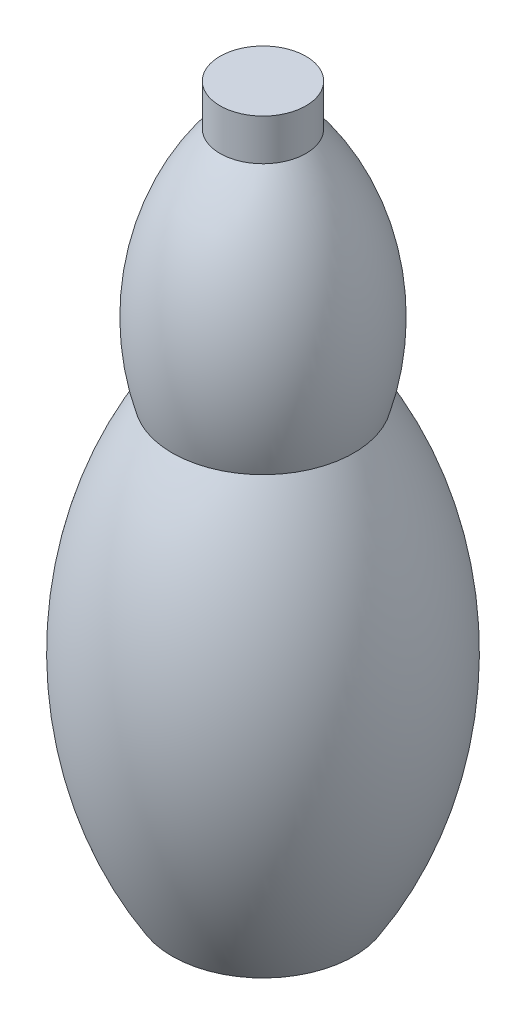
ISO-10303-21;
HEADER;
FILE_DESCRIPTION(('STEP AP214'),'2;1');
FILE_NAME('part.step','',(''),(''),'','','');
FILE_SCHEMA(('AUTOMOTIVE_DESIGN { 1 0 10303 214 1 1 1 1 }'));
ENDSEC;
DATA;
#1=APPLICATION_CONTEXT('core data for automotive mechanical design processes');
#2=APPLICATION_PROTOCOL_DEFINITION('international standard','automotive_design',2000,#1);
#3=PRODUCT_CONTEXT('',#1,'mechanical');
#4=PRODUCT('Part','Part','',(#3));
#5=PRODUCT_RELATED_PRODUCT_CATEGORY('part','',(#4));
#6=PRODUCT_DEFINITION_FORMATION('','',#4);
#7=PRODUCT_DEFINITION_CONTEXT('part definition',#1,'design');
#8=PRODUCT_DEFINITION('design','',#6,#7);
#9=PRODUCT_DEFINITION_SHAPE('','',#8);
#10=(LENGTH_UNIT() NAMED_UNIT(*) SI_UNIT(.MILLI.,.METRE.));
#11=(NAMED_UNIT(*) PLANE_ANGLE_UNIT() SI_UNIT($,.RADIAN.));
#12=(NAMED_UNIT(*) SI_UNIT($,.STERADIAN.) SOLID_ANGLE_UNIT());
#13=UNCERTAINTY_MEASURE_WITH_UNIT(LENGTH_MEASURE(1.E-05),#10,'distance_accuracy_value','');
#14=(GEOMETRIC_REPRESENTATION_CONTEXT(3) GLOBAL_UNCERTAINTY_ASSIGNED_CONTEXT((#13)) GLOBAL_UNIT_ASSIGNED_CONTEXT((#10,
#11,#12)) REPRESENTATION_CONTEXT('',''));
#15=CARTESIAN_POINT('',(0.,0.,0.));
#16=DIRECTION('',(0.,0.,1.));
#17=DIRECTION('',(1.,0.,0.));
#18=AXIS2_PLACEMENT_3D('',#15,#16,#17);
#19=CARTESIAN_POINT('',(19.1239630264316,0.,0.));
#20=DIRECTION('',(0.,-1.,0.));
#21=DIRECTION('',(0.,0.,-1.));
#22=AXIS2_PLACEMENT_3D('',#19,#20,#21);
#23=PLANE('',#22);
#24=CARTESIAN_POINT('',(0.,0.,0.));
#25=DIRECTION('',(0.,-1.,0.));
#26=DIRECTION('',(0.,0.,-1.));
#27=AXIS2_PLACEMENT_3D('',#24,#25,#26);
#28=CIRCLE('',#27,19.1239630264317);
#29=CARTESIAN_POINT('',(0.,0.,-19.1239630264317));
#30=VERTEX_POINT('',#29);
#31=EDGE_CURVE('E51',#30,#30,#28,.T.);
#32=ORIENTED_EDGE('',*,*,#31,.T.);
#33=EDGE_LOOP('',(#32));
#34=FACE_BOUND('',#33,.T.);
#35=ADVANCED_FACE('F37',(#34),#23,.T.);
#36=CARTESIAN_POINT('',(0.,150.,0.));
#37=DIRECTION('',(0.,1.,0.));
#38=DIRECTION('',(0.,0.,1.));
#39=AXIS2_PLACEMENT_3D('',#36,#37,#38);
#40=PLANE('',#39);
#41=CARTESIAN_POINT('',(0.,150.,0.));
#42=DIRECTION('',(0.,-1.,0.));
#43=DIRECTION('',(0.,0.,-1.));
#44=AXIS2_PLACEMENT_3D('',#41,#42,#43);
#45=CIRCLE('',#44,9.04211459679339);
#46=CARTESIAN_POINT('',(0.,150.,-9.04211459679339));
#47=VERTEX_POINT('',#46);
#48=EDGE_CURVE('E10',#47,#47,#45,.T.);
#49=ORIENTED_EDGE('',*,*,#48,.F.);
#50=EDGE_LOOP('',(#49));
#51=FACE_BOUND('',#50,.T.);
#52=ADVANCED_FACE('F69',(#51),#40,.T.);
#53=CARTESIAN_POINT('',(0.,0.,0.));
#54=DIRECTION('',(0.,-1.,0.));
#55=DIRECTION('',(0.,0.,-1.));
#56=AXIS2_PLACEMENT_3D('',#53,#54,#55);
#57=CYLINDRICAL_SURFACE('',#56,9.04211459679339);
#58=ORIENTED_EDGE('',*,*,#48,.T.);
#59=EDGE_LOOP('',(#58));
#60=FACE_BOUND('',#59,.T.);
#61=CARTESIAN_POINT('',(0.,141.305283640041,0.));
#62=DIRECTION('',(0.,-1.,0.));
#63=DIRECTION('',(0.,0.,-1.));
#64=AXIS2_PLACEMENT_3D('',#61,#62,#63);
#65=CIRCLE('',#64,9.04211459679339);
#66=CARTESIAN_POINT('',(0.,141.305283640041,-9.04211459679339));
#67=VERTEX_POINT('',#66);
#68=EDGE_CURVE('E43',#67,#67,#65,.T.);
#69=ORIENTED_EDGE('',*,*,#68,.F.);
#70=EDGE_LOOP('',(#69));
#71=FACE_BOUND('',#70,.T.);
#72=ADVANCED_FACE('F66',(#60,#71),#57,.T.);
#73=CARTESIAN_POINT('',(0.,106.985814249895,0.));
#74=DIRECTION('',(0.,-1.,0.));
#75=DIRECTION('',(0.,0.,-1.));
#76=AXIS2_PLACEMENT_3D('',#73,#74,#75);
#77=DEGENERATE_TOROIDAL_SURFACE('',#76,32.8241138648879,54.1350816460715,.F.);
#78=ORIENTED_EDGE('',*,*,#68,.T.);
#79=EDGE_LOOP('',(#78));
#80=FACE_BOUND('',#79,.T.);
#81=CARTESIAN_POINT('',(0.,91.7541245169604,0.));
#82=DIRECTION('',(0.,-1.,0.));
#83=DIRECTION('',(0.,0.,-1.));
#84=AXIS2_PLACEMENT_3D('',#81,#82,#83);
#85=CIRCLE('',#84,19.1239630264316);
#86=CARTESIAN_POINT('',(0.,91.7541245169604,-19.1239630264316));
#87=VERTEX_POINT('',#86);
#88=EDGE_CURVE('E47',#87,#87,#85,.T.);
#89=ORIENTED_EDGE('',*,*,#88,.F.);
#90=EDGE_LOOP('',(#89));
#91=FACE_BOUND('',#90,.T.);
#92=ADVANCED_FACE('F60',(#80,#91),#77,.F.);
#93=CARTESIAN_POINT('',(0.,45.8770622584802,0.));
#94=DIRECTION('',(0.,-1.,0.));
#95=DIRECTION('',(0.,0.,-1.));
#96=AXIS2_PLACEMENT_3D('',#93,#94,#95);
#97=DEGENERATE_TOROIDAL_SURFACE('',#96,54.7620385374229,86.9703746603542,.F.);
#98=ORIENTED_EDGE('',*,*,#88,.T.);
#99=EDGE_LOOP('',(#98));
#100=FACE_BOUND('',#99,.T.);
#101=ORIENTED_EDGE('',*,*,#31,.F.);
#102=EDGE_LOOP('',(#101));
#103=FACE_BOUND('',#102,.T.);
#104=ADVANCED_FACE('F58',(#100,#103),#97,.F.);
#105=CLOSED_SHELL('',(#35,#52,#72,#92,#104));
#106=MANIFOLD_SOLID_BREP('B2',#105);
#107=ADVANCED_BREP_SHAPE_REPRESENTATION('',(#18,#106),#14);
#108=SHAPE_DEFINITION_REPRESENTATION(#9,#107);
ENDSEC;
END-ISO-10303-21;
